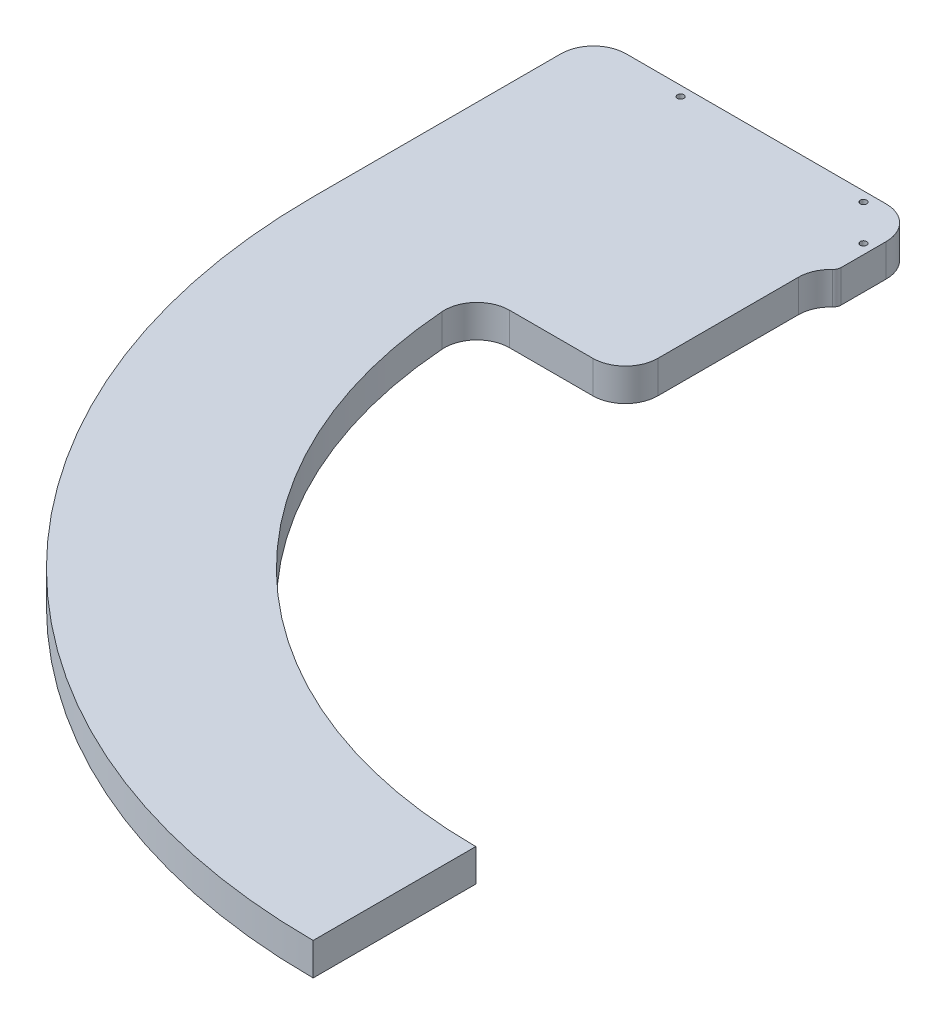
ISO-10303-21;
HEADER;
FILE_DESCRIPTION(('STEP AP214'),'2;1');
FILE_NAME('part.step','',(''),(''),'','','');
FILE_SCHEMA(('AUTOMOTIVE_DESIGN { 1 0 10303 214 1 1 1 1 }'));
ENDSEC;
DATA;
#1=APPLICATION_CONTEXT('core data for automotive mechanical design processes');
#2=APPLICATION_PROTOCOL_DEFINITION('international standard','automotive_design',2000,#1);
#3=PRODUCT_CONTEXT('',#1,'mechanical');
#4=PRODUCT('Part','Part','',(#3));
#5=PRODUCT_RELATED_PRODUCT_CATEGORY('part','',(#4));
#6=PRODUCT_DEFINITION_FORMATION('','',#4);
#7=PRODUCT_DEFINITION_CONTEXT('part definition',#1,'design');
#8=PRODUCT_DEFINITION('design','',#6,#7);
#9=PRODUCT_DEFINITION_SHAPE('','',#8);
#10=(LENGTH_UNIT() NAMED_UNIT(*) SI_UNIT(.MILLI.,.METRE.));
#11=(NAMED_UNIT(*) PLANE_ANGLE_UNIT() SI_UNIT($,.RADIAN.));
#12=(NAMED_UNIT(*) SI_UNIT($,.STERADIAN.) SOLID_ANGLE_UNIT());
#13=UNCERTAINTY_MEASURE_WITH_UNIT(LENGTH_MEASURE(1.E-05),#10,'distance_accuracy_value','');
#14=(GEOMETRIC_REPRESENTATION_CONTEXT(3) GLOBAL_UNCERTAINTY_ASSIGNED_CONTEXT((#13)) GLOBAL_UNIT_ASSIGNED_CONTEXT((#10,
#11,#12)) REPRESENTATION_CONTEXT('',''));
#15=CARTESIAN_POINT('',(0.,0.,0.));
#16=DIRECTION('',(0.,0.,1.));
#17=DIRECTION('',(1.,0.,0.));
#18=AXIS2_PLACEMENT_3D('',#15,#16,#17);
#19=CARTESIAN_POINT('',(246.106976730559,-10.,-1959.36496603701));
#20=DIRECTION('',(1.,0.,0.));
#21=DIRECTION('',(0.,0.,-1.));
#22=AXIS2_PLACEMENT_3D('',#19,#20,#21);
#23=PLANE('',#22);
#24=DIRECTION('',(0.,0.,-1.));
#25=VECTOR('',#24,1.);
#26=CARTESIAN_POINT('',(246.106976730559,0.,-1959.36496603701));
#27=LINE('',#26,#25);
#28=CARTESIAN_POINT('',(246.106976730559,0.,-1960.53011742692));
#29=VERTEX_POINT('',#28);
#30=CARTESIAN_POINT('',(246.106976730559,0.,-1974.36496603701));
#31=VERTEX_POINT('',#30);
#32=EDGE_CURVE('E177',#29,#31,#27,.T.);
#33=ORIENTED_EDGE('',*,*,#32,.F.);
#34=DIRECTION('',(0.,-1.,0.));
#35=VECTOR('',#34,1.);
#36=CARTESIAN_POINT('',(246.106976730559,-10.,-1960.53011742692));
#37=LINE('',#36,#35);
#38=CARTESIAN_POINT('',(246.106976730559,-10.,-1960.53011742692));
#39=VERTEX_POINT('',#38);
#40=EDGE_CURVE('E47',#29,#39,#37,.T.);
#41=ORIENTED_EDGE('',*,*,#40,.T.);
#42=DIRECTION('',(0.,0.,-1.));
#43=VECTOR('',#42,1.);
#44=CARTESIAN_POINT('',(246.106976730559,-10.,-1959.36496603701));
#45=LINE('',#44,#43);
#46=CARTESIAN_POINT('',(246.106976730559,-10.,-1974.36496603701));
#47=VERTEX_POINT('',#46);
#48=EDGE_CURVE('E198',#39,#47,#45,.T.);
#49=ORIENTED_EDGE('',*,*,#48,.T.);
#50=DIRECTION('',(0.,1.,0.));
#51=VECTOR('',#50,1.);
#52=CARTESIAN_POINT('',(246.106976730559,-10.,-1974.36496603701));
#53=LINE('',#52,#51);
#54=EDGE_CURVE('E221',#47,#31,#53,.T.);
#55=ORIENTED_EDGE('',*,*,#54,.T.);
#56=EDGE_LOOP('',(#33,#41,#49,#55));
#57=FACE_BOUND('',#56,.T.);
#58=ADVANCED_FACE('F39',(#57),#23,.T.);
#59=CARTESIAN_POINT('',(242.106976730559,-10.,-1898.16496623457));
#60=DIRECTION('',(1.,0.,0.));
#61=DIRECTION('',(0.,0.,-1.));
#62=AXIS2_PLACEMENT_3D('',#59,#60,#61);
#63=PLANE('',#62);
#64=DIRECTION('',(0.,0.,-1.));
#65=VECTOR('',#64,1.);
#66=CARTESIAN_POINT('',(242.106976730559,-10.,-1898.16496623457));
#67=LINE('',#66,#65);
#68=CARTESIAN_POINT('',(242.106976730559,-10.,-1908.16496623457));
#69=VERTEX_POINT('',#68);
#70=CARTESIAN_POINT('',(242.106976730559,-10.,-1951.36496603701));
#71=VERTEX_POINT('',#70);
#72=EDGE_CURVE('E158',#69,#71,#67,.T.);
#73=ORIENTED_EDGE('',*,*,#72,.T.);
#74=DIRECTION('',(0.,-1.,0.));
#75=VECTOR('',#74,1.);
#76=CARTESIAN_POINT('',(242.106976730559,0.,-1951.36496603701));
#77=LINE('',#76,#75);
#78=CARTESIAN_POINT('',(242.106976730559,0.,-1951.36496603701));
#79=VERTEX_POINT('',#78);
#80=EDGE_CURVE('E226',#71,#79,#77,.F.);
#81=ORIENTED_EDGE('',*,*,#80,.T.);
#82=DIRECTION('',(0.,0.,-1.));
#83=VECTOR('',#82,1.);
#84=CARTESIAN_POINT('',(242.106976730559,0.,-1898.16496623457));
#85=LINE('',#84,#83);
#86=CARTESIAN_POINT('',(242.106976730559,0.,-1908.16496623457));
#87=VERTEX_POINT('',#86);
#88=EDGE_CURVE('E195',#87,#79,#85,.T.);
#89=ORIENTED_EDGE('',*,*,#88,.F.);
#90=DIRECTION('',(0.,1.,0.));
#91=VECTOR('',#90,1.);
#92=CARTESIAN_POINT('',(242.106976730559,-10.,-1908.16496623457));
#93=LINE('',#92,#91);
#94=EDGE_CURVE('E224',#87,#69,#93,.F.);
#95=ORIENTED_EDGE('',*,*,#94,.T.);
#96=EDGE_LOOP('',(#73,#81,#89,#95));
#97=FACE_BOUND('',#96,.T.);
#98=ADVANCED_FACE('F259',(#97),#63,.T.);
#99=CARTESIAN_POINT('',(242.106976730559,-10.,-1898.16496623457));
#100=DIRECTION('',(0.,0.,1.));
#101=DIRECTION('',(1.,0.,0.));
#102=AXIS2_PLACEMENT_3D('',#99,#100,#101);
#103=PLANE('',#102);
#104=DIRECTION('',(1.,0.,0.));
#105=VECTOR('',#104,1.);
#106=CARTESIAN_POINT('',(242.106976730559,-10.,-1898.16496623457));
#107=LINE('',#106,#105);
#108=CARTESIAN_POINT('',(206.471339137691,-10.,-1898.16496623457));
#109=VERTEX_POINT('',#108);
#110=CARTESIAN_POINT('',(232.106976730559,-10.,-1898.16496623457));
#111=VERTEX_POINT('',#110);
#112=EDGE_CURVE('E172',#109,#111,#107,.T.);
#113=ORIENTED_EDGE('',*,*,#112,.T.);
#114=DIRECTION('',(0.,1.,0.));
#115=VECTOR('',#114,1.);
#116=CARTESIAN_POINT('',(232.106976730559,-10.,-1898.16496623457));
#117=LINE('',#116,#115);
#118=CARTESIAN_POINT('',(232.106976730559,0.,-1898.16496623457));
#119=VERTEX_POINT('',#118);
#120=EDGE_CURVE('E231',#111,#119,#117,.T.);
#121=ORIENTED_EDGE('',*,*,#120,.T.);
#122=DIRECTION('',(1.,0.,0.));
#123=VECTOR('',#122,1.);
#124=CARTESIAN_POINT('',(242.106976730559,0.,-1898.16496623457));
#125=LINE('',#124,#123);
#126=CARTESIAN_POINT('',(206.471339137691,0.,-1898.16496623457));
#127=VERTEX_POINT('',#126);
#128=EDGE_CURVE('E192',#127,#119,#125,.T.);
#129=ORIENTED_EDGE('',*,*,#128,.F.);
#130=DIRECTION('',(0.,-1.,0.));
#131=VECTOR('',#130,1.);
#132=CARTESIAN_POINT('',(206.471339137691,-10.,-1898.16496623457));
#133=LINE('',#132,#131);
#134=EDGE_CURVE('E229',#127,#109,#133,.T.);
#135=ORIENTED_EDGE('',*,*,#134,.T.);
#136=EDGE_LOOP('',(#113,#121,#129,#135));
#137=FACE_BOUND('',#136,.T.);
#138=ADVANCED_FACE('F268',(#137),#103,.T.);
#139=CARTESIAN_POINT('',(344.106976730557,-10.,-1898.16496623457));
#140=DIRECTION('',(0.,1.,0.));
#141=DIRECTION('',(0.,0.,1.));
#142=AXIS2_PLACEMENT_3D('',#139,#140,#141);
#143=CYLINDRICAL_SURFACE('',#142,147.998437438961);
#144=CARTESIAN_POINT('',(344.106976730557,-10.,-1898.16496623457));
#145=DIRECTION('',(0.,-1.,0.));
#146=DIRECTION('',(0.,0.,1.));
#147=AXIS2_PLACEMENT_3D('',#144,#145,#146);
#148=CIRCLE('',#147,147.998437438961);
#149=CARTESIAN_POINT('',(344.106976730557,-10.,-1750.16652879561));
#150=VERTEX_POINT('',#149);
#151=CARTESIAN_POINT('',(196.497629279292,-10.,-1887.44032034831));
#152=VERTEX_POINT('',#151);
#153=EDGE_CURVE('E166',#150,#152,#148,.T.);
#154=ORIENTED_EDGE('',*,*,#153,.T.);
#155=DIRECTION('',(0.,1.,0.));
#156=VECTOR('',#155,1.);
#157=CARTESIAN_POINT('',(196.497629279292,-10.,-1887.44032034831));
#158=LINE('',#157,#156);
#159=CARTESIAN_POINT('',(196.497629279292,0.,-1887.44032034831));
#160=VERTEX_POINT('',#159);
#161=EDGE_CURVE('E234',#152,#160,#158,.T.);
#162=ORIENTED_EDGE('',*,*,#161,.T.);
#163=CARTESIAN_POINT('',(344.106976730557,0.,-1898.16496623457));
#164=DIRECTION('',(0.,-1.,0.));
#165=DIRECTION('',(0.,0.,1.));
#166=AXIS2_PLACEMENT_3D('',#163,#164,#165);
#167=CIRCLE('',#166,147.998437438961);
#168=CARTESIAN_POINT('',(344.106976730557,0.,-1750.16652879561));
#169=VERTEX_POINT('',#168);
#170=EDGE_CURVE('E189',#169,#160,#167,.T.);
#171=ORIENTED_EDGE('',*,*,#170,.F.);
#172=DIRECTION('',(0.,1.,0.));
#173=VECTOR('',#172,1.);
#174=CARTESIAN_POINT('',(344.106976730557,-10.,-1750.16652879561));
#175=LINE('',#174,#173);
#176=EDGE_CURVE('E199',#150,#169,#175,.T.);
#177=ORIENTED_EDGE('',*,*,#176,.F.);
#178=EDGE_LOOP('',(#154,#162,#171,#177));
#179=FACE_BOUND('',#178,.T.);
#180=ADVANCED_FACE('F275',(#179),#143,.F.);
#181=CARTESIAN_POINT('',(344.106976730557,-10.,-1750.16652879561));
#182=DIRECTION('',(1.,0.,0.));
#183=DIRECTION('',(0.,0.,-1.));
#184=AXIS2_PLACEMENT_3D('',#181,#182,#183);
#185=PLANE('',#184);
#186=DIRECTION('',(0.,0.,-1.));
#187=VECTOR('',#186,1.);
#188=CARTESIAN_POINT('',(344.106976730557,0.,-1750.16652879561));
#189=LINE('',#188,#187);
#190=CARTESIAN_POINT('',(344.106976730557,0.,-1700.16652879561));
#191=VERTEX_POINT('',#190);
#192=EDGE_CURVE('E186',#191,#169,#189,.T.);
#193=ORIENTED_EDGE('',*,*,#192,.F.);
#194=DIRECTION('',(0.,1.,0.));
#195=VECTOR('',#194,1.);
#196=CARTESIAN_POINT('',(344.106976730557,-10.,-1700.16652879561));
#197=LINE('',#196,#195);
#198=CARTESIAN_POINT('',(344.106976730557,-10.,-1700.16652879561));
#199=VERTEX_POINT('',#198);
#200=EDGE_CURVE('E157',#199,#191,#197,.T.);
#201=ORIENTED_EDGE('',*,*,#200,.F.);
#202=DIRECTION('',(0.,0.,-1.));
#203=VECTOR('',#202,1.);
#204=CARTESIAN_POINT('',(344.106976730557,-10.,-1750.16652879561));
#205=LINE('',#204,#203);
#206=EDGE_CURVE('E164',#199,#150,#205,.T.);
#207=ORIENTED_EDGE('',*,*,#206,.T.);
#208=ORIENTED_EDGE('',*,*,#176,.T.);
#209=EDGE_LOOP('',(#193,#201,#207,#208));
#210=FACE_BOUND('',#209,.T.);
#211=ADVANCED_FACE('F279',(#210),#185,.T.);
#212=CARTESIAN_POINT('',(344.106976730557,-10.,-1898.16496623457));
#213=DIRECTION('',(0.,1.,0.));
#214=DIRECTION('',(0.,0.,1.));
#215=AXIS2_PLACEMENT_3D('',#212,#213,#214);
#216=CYLINDRICAL_SURFACE('',#215,197.998437438961);
#217=CARTESIAN_POINT('',(344.106976730557,0.,-1898.16496623457));
#218=DIRECTION('',(0.,1.,0.));
#219=DIRECTION('',(0.,0.,-1.));
#220=AXIS2_PLACEMENT_3D('',#217,#218,#219);
#221=CIRCLE('',#220,197.998437438961);
#222=CARTESIAN_POINT('',(146.108539291596,0.,-1898.16496623457));
#223=VERTEX_POINT('',#222);
#224=EDGE_CURVE('E156',#223,#191,#221,.T.);
#225=ORIENTED_EDGE('',*,*,#224,.F.);
#226=DIRECTION('',(0.,1.,0.));
#227=VECTOR('',#226,1.);
#228=CARTESIAN_POINT('',(146.108539291596,-10.,-1898.16496623457));
#229=LINE('',#228,#227);
#230=CARTESIAN_POINT('',(146.108539291596,-10.,-1898.16496623457));
#231=VERTEX_POINT('',#230);
#232=EDGE_CURVE('E142',#231,#223,#229,.T.);
#233=ORIENTED_EDGE('',*,*,#232,.F.);
#234=CARTESIAN_POINT('',(344.106976730557,-10.,-1898.16496623457));
#235=DIRECTION('',(0.,1.,0.));
#236=DIRECTION('',(0.,0.,-1.));
#237=AXIS2_PLACEMENT_3D('',#234,#235,#236);
#238=CIRCLE('',#237,197.998437438961);
#239=EDGE_CURVE('E149',#231,#199,#238,.T.);
#240=ORIENTED_EDGE('',*,*,#239,.T.);
#241=ORIENTED_EDGE('',*,*,#200,.T.);
#242=EDGE_LOOP('',(#225,#233,#240,#241));
#243=FACE_BOUND('',#242,.T.);
#244=ADVANCED_FACE('F154',(#243),#216,.T.);
#245=CARTESIAN_POINT('',(146.108539291596,-10.,-1980.36496603701));
#246=DIRECTION('',(-1.,0.,0.));
#247=DIRECTION('',(0.,0.,1.));
#248=AXIS2_PLACEMENT_3D('',#245,#246,#247);
#249=PLANE('',#248);
#250=DIRECTION('',(0.,0.,1.));
#251=VECTOR('',#250,1.);
#252=CARTESIAN_POINT('',(146.108539291596,0.,-1980.36496603701));
#253=LINE('',#252,#251);
#254=CARTESIAN_POINT('',(146.108539291596,0.,-1974.36496603701));
#255=VERTEX_POINT('',#254);
#256=EDGE_CURVE('E183',#255,#223,#253,.T.);
#257=ORIENTED_EDGE('',*,*,#256,.F.);
#258=DIRECTION('',(0.,1.,0.));
#259=VECTOR('',#258,1.);
#260=CARTESIAN_POINT('',(146.108539291596,-10.,-1974.36496603701));
#261=LINE('',#260,#259);
#262=CARTESIAN_POINT('',(146.108539291596,-10.,-1974.36496603701));
#263=VERTEX_POINT('',#262);
#264=EDGE_CURVE('E145',#255,#263,#261,.F.);
#265=ORIENTED_EDGE('',*,*,#264,.T.);
#266=DIRECTION('',(0.,0.,1.));
#267=VECTOR('',#266,1.);
#268=CARTESIAN_POINT('',(146.108539291596,-10.,-1984.36496603701));
#269=LINE('',#268,#267);
#270=EDGE_CURVE('E138',#263,#231,#269,.T.);
#271=ORIENTED_EDGE('',*,*,#270,.T.);
#272=ORIENTED_EDGE('',*,*,#232,.T.);
#273=EDGE_LOOP('',(#257,#265,#271,#272));
#274=FACE_BOUND('',#273,.T.);
#275=ADVANCED_FACE('F141',(#274),#249,.T.);
#276=CARTESIAN_POINT('',(246.106976730559,-10.,-1984.36496603701));
#277=DIRECTION('',(0.,0.,-1.));
#278=DIRECTION('',(-1.,0.,0.));
#279=AXIS2_PLACEMENT_3D('',#276,#277,#278);
#280=PLANE('',#279);
#281=DIRECTION('',(-1.,0.,0.));
#282=VECTOR('',#281,1.);
#283=CARTESIAN_POINT('',(246.106976730559,-10.,-1984.36496603701));
#284=LINE('',#283,#282);
#285=CARTESIAN_POINT('',(236.106976730559,-10.,-1984.36496603701));
#286=VERTEX_POINT('',#285);
#287=CARTESIAN_POINT('',(156.108539291596,-10.,-1984.36496603701));
#288=VERTEX_POINT('',#287);
#289=EDGE_CURVE('E150',#286,#288,#284,.T.);
#290=ORIENTED_EDGE('',*,*,#289,.T.);
#291=DIRECTION('',(0.,1.,0.));
#292=VECTOR('',#291,1.);
#293=CARTESIAN_POINT('',(156.108539291596,-10.,-1984.36496603701));
#294=LINE('',#293,#292);
#295=CARTESIAN_POINT('',(156.108539291596,0.,-1984.36496603701));
#296=VERTEX_POINT('',#295);
#297=EDGE_CURVE('E204',#288,#296,#294,.T.);
#298=ORIENTED_EDGE('',*,*,#297,.T.);
#299=DIRECTION('',(-1.,0.,0.));
#300=VECTOR('',#299,1.);
#301=CARTESIAN_POINT('',(246.106976730559,0.,-1984.36496603701));
#302=LINE('',#301,#300);
#303=CARTESIAN_POINT('',(236.106976730559,0.,-1984.36496603701));
#304=VERTEX_POINT('',#303);
#305=EDGE_CURVE('E179',#304,#296,#302,.T.);
#306=ORIENTED_EDGE('',*,*,#305,.F.);
#307=DIRECTION('',(0.,1.,0.));
#308=VECTOR('',#307,1.);
#309=CARTESIAN_POINT('',(236.106976730559,-10.,-1984.36496603701));
#310=LINE('',#309,#308);
#311=EDGE_CURVE('E201',#304,#286,#310,.F.);
#312=ORIENTED_EDGE('',*,*,#311,.T.);
#313=EDGE_LOOP('',(#290,#298,#306,#312));
#314=FACE_BOUND('',#313,.T.);
#315=ADVANCED_FACE('F287',(#314),#280,.T.);
#316=CARTESIAN_POINT('',(344.106976730557,-10.,-1898.16496623457));
#317=DIRECTION('',(0.,-1.,0.));
#318=DIRECTION('',(0.,0.,-1.));
#319=AXIS2_PLACEMENT_3D('',#316,#317,#318);
#320=PLANE('',#319);
#321=CARTESIAN_POINT('',(175.906976730563,-9.99999999999999,-1981.36496603701));
#322=DIRECTION('',(0.,1.,0.));
#323=DIRECTION('',(0.,0.,1.));
#324=AXIS2_PLACEMENT_3D('',#321,#322,#323);
#325=CIRCLE('',#324,1.);
#326=CARTESIAN_POINT('',(175.906976730563,-9.99999999999999,-1980.36496603701));
#327=VERTEX_POINT('',#326);
#328=EDGE_CURVE('E303',#327,#327,#325,.T.);
#329=ORIENTED_EDGE('',*,*,#328,.T.);
#330=EDGE_LOOP('',(#329));
#331=FACE_BOUND('',#330,.T.);
#332=CARTESIAN_POINT('',(232.106976730564,-9.99999999999999,-1981.36496603701));
#333=DIRECTION('',(0.,1.,0.));
#334=DIRECTION('',(0.,0.,1.));
#335=AXIS2_PLACEMENT_3D('',#332,#333,#334);
#336=CIRCLE('',#335,0.999999999999973);
#337=CARTESIAN_POINT('',(232.106976730564,-9.99999999999999,-1980.36496603701));
#338=VERTEX_POINT('',#337);
#339=EDGE_CURVE('E297',#338,#338,#336,.T.);
#340=ORIENTED_EDGE('',*,*,#339,.T.);
#341=EDGE_LOOP('',(#340));
#342=FACE_BOUND('',#341,.T.);
#343=CARTESIAN_POINT('',(243.106976730564,-9.99999999999999,-1970.36496603701));
#344=DIRECTION('',(0.,1.,0.));
#345=DIRECTION('',(0.,0.,1.));
#346=AXIS2_PLACEMENT_3D('',#343,#344,#345);
#347=CIRCLE('',#346,0.999999999999973);
#348=CARTESIAN_POINT('',(243.106976730564,-9.99999999999999,-1969.36496603701));
#349=VERTEX_POINT('',#348);
#350=EDGE_CURVE('E180',#349,#349,#347,.T.);
#351=ORIENTED_EDGE('',*,*,#350,.T.);
#352=EDGE_LOOP('',(#351));
#353=FACE_BOUND('',#352,.T.);
#354=ORIENTED_EDGE('',*,*,#48,.F.);
#355=CARTESIAN_POINT('',(243.606976730559,-10.,-1960.53011742692));
#356=DIRECTION('',(0.,-1.,0.));
#357=DIRECTION('',(0.,0.,-1.));
#358=AXIS2_PLACEMENT_3D('',#355,#356,#357);
#359=CIRCLE('',#358,2.5);
#360=CARTESIAN_POINT('',(245.306976730559,-10.,-1958.69708714894));
#361=VERTEX_POINT('',#360);
#362=EDGE_CURVE('E11',#39,#361,#359,.T.);
#363=ORIENTED_EDGE('',*,*,#362,.T.);
#364=CARTESIAN_POINT('',(252.106976730559,-10.,-1951.36496603701));
#365=DIRECTION('',(0.,-1.,0.));
#366=DIRECTION('',(0.,0.,-1.));
#367=AXIS2_PLACEMENT_3D('',#364,#365,#366);
#368=CIRCLE('',#367,10.);
#369=EDGE_CURVE('E239',#361,#71,#368,.F.);
#370=ORIENTED_EDGE('',*,*,#369,.T.);
#371=ORIENTED_EDGE('',*,*,#72,.F.);
#372=CARTESIAN_POINT('',(232.106976730559,-10.,-1908.16496623457));
#373=DIRECTION('',(0.,-1.,0.));
#374=DIRECTION('',(0.,0.,-1.));
#375=AXIS2_PLACEMENT_3D('',#372,#373,#374);
#376=CIRCLE('',#375,10.);
#377=EDGE_CURVE('E214',#69,#111,#376,.T.);
#378=ORIENTED_EDGE('',*,*,#377,.T.);
#379=ORIENTED_EDGE('',*,*,#112,.F.);
#380=CARTESIAN_POINT('',(206.471339137691,-10.,-1888.16496623457));
#381=DIRECTION('',(0.,-1.,0.));
#382=DIRECTION('',(0.,0.,-1.));
#383=AXIS2_PLACEMENT_3D('',#380,#381,#382);
#384=CIRCLE('',#383,10.);
#385=EDGE_CURVE('E243',#109,#152,#384,.F.);
#386=ORIENTED_EDGE('',*,*,#385,.T.);
#387=ORIENTED_EDGE('',*,*,#153,.F.);
#388=ORIENTED_EDGE('',*,*,#206,.F.);
#389=ORIENTED_EDGE('',*,*,#239,.F.);
#390=ORIENTED_EDGE('',*,*,#270,.F.);
#391=CARTESIAN_POINT('',(156.108539291596,-10.,-1974.36496603701));
#392=DIRECTION('',(0.,-1.,0.));
#393=DIRECTION('',(0.,0.,-1.));
#394=AXIS2_PLACEMENT_3D('',#391,#392,#393);
#395=CIRCLE('',#394,10.);
#396=EDGE_CURVE('E219',#263,#288,#395,.T.);
#397=ORIENTED_EDGE('',*,*,#396,.T.);
#398=ORIENTED_EDGE('',*,*,#289,.F.);
#399=CARTESIAN_POINT('',(236.106976730559,-10.,-1974.36496603701));
#400=DIRECTION('',(0.,-1.,0.));
#401=DIRECTION('',(0.,0.,-1.));
#402=AXIS2_PLACEMENT_3D('',#399,#400,#401);
#403=CIRCLE('',#402,10.);
#404=EDGE_CURVE('E216',#286,#47,#403,.T.);
#405=ORIENTED_EDGE('',*,*,#404,.T.);
#406=EDGE_LOOP('',(#354,#363,#370,#371,#378,#379,#386,#387,#388,#389,#390,#397,#398,#405));
#407=FACE_BOUND('',#406,.T.);
#408=ADVANCED_FACE('F161',(#331,#342,#353,#407),#320,.T.);
#409=CARTESIAN_POINT('',(344.106976730557,0.,-1898.16496623457));
#410=DIRECTION('',(0.,-1.,0.));
#411=DIRECTION('',(0.,0.,-1.));
#412=AXIS2_PLACEMENT_3D('',#409,#410,#411);
#413=PLANE('',#412);
#414=CARTESIAN_POINT('',(175.906976730563,0.,-1981.36496603701));
#415=DIRECTION('',(0.,1.,0.));
#416=DIRECTION('',(0.,0.,1.));
#417=AXIS2_PLACEMENT_3D('',#414,#415,#416);
#418=CIRCLE('',#417,1.);
#419=CARTESIAN_POINT('',(175.906976730563,0.,-1980.36496603701));
#420=VERTEX_POINT('',#419);
#421=EDGE_CURVE('E306',#420,#420,#418,.T.);
#422=ORIENTED_EDGE('',*,*,#421,.F.);
#423=EDGE_LOOP('',(#422));
#424=FACE_BOUND('',#423,.T.);
#425=CARTESIAN_POINT('',(232.106976730564,0.,-1981.36496603701));
#426=DIRECTION('',(0.,1.,0.));
#427=DIRECTION('',(0.,0.,1.));
#428=AXIS2_PLACEMENT_3D('',#425,#426,#427);
#429=CIRCLE('',#428,0.999999999999973);
#430=CARTESIAN_POINT('',(232.106976730564,0.,-1980.36496603701));
#431=VERTEX_POINT('',#430);
#432=EDGE_CURVE('E300',#431,#431,#429,.T.);
#433=ORIENTED_EDGE('',*,*,#432,.F.);
#434=EDGE_LOOP('',(#433));
#435=FACE_BOUND('',#434,.T.);
#436=CARTESIAN_POINT('',(243.106976730564,0.,-1970.36496603701));
#437=DIRECTION('',(0.,1.,0.));
#438=DIRECTION('',(0.,0.,1.));
#439=AXIS2_PLACEMENT_3D('',#436,#437,#438);
#440=CIRCLE('',#439,0.999999999999973);
#441=CARTESIAN_POINT('',(243.106976730564,0.,-1969.36496603701));
#442=VERTEX_POINT('',#441);
#443=EDGE_CURVE('E294',#442,#442,#440,.T.);
#444=ORIENTED_EDGE('',*,*,#443,.F.);
#445=EDGE_LOOP('',(#444));
#446=FACE_BOUND('',#445,.T.);
#447=CARTESIAN_POINT('',(252.106976730559,0.,-1951.36496603701));
#448=DIRECTION('',(0.,-1.,0.));
#449=DIRECTION('',(0.,0.,-1.));
#450=AXIS2_PLACEMENT_3D('',#447,#448,#449);
#451=CIRCLE('',#450,10.);
#452=CARTESIAN_POINT('',(245.306976730559,0.,-1958.69708714894));
#453=VERTEX_POINT('',#452);
#454=EDGE_CURVE('E237',#79,#453,#451,.T.);
#455=ORIENTED_EDGE('',*,*,#454,.T.);
#456=CARTESIAN_POINT('',(243.606976730559,0.,-1960.53011742692));
#457=DIRECTION('',(0.,-1.,0.));
#458=DIRECTION('',(0.,0.,-1.));
#459=AXIS2_PLACEMENT_3D('',#456,#457,#458);
#460=CIRCLE('',#459,2.5);
#461=EDGE_CURVE('E61',#453,#29,#460,.F.);
#462=ORIENTED_EDGE('',*,*,#461,.T.);
#463=ORIENTED_EDGE('',*,*,#32,.T.);
#464=CARTESIAN_POINT('',(236.106976730559,0.,-1974.36496603701));
#465=DIRECTION('',(0.,-1.,0.));
#466=DIRECTION('',(0.,0.,-1.));
#467=AXIS2_PLACEMENT_3D('',#464,#465,#466);
#468=CIRCLE('',#467,10.);
#469=EDGE_CURVE('E209',#31,#304,#468,.F.);
#470=ORIENTED_EDGE('',*,*,#469,.T.);
#471=ORIENTED_EDGE('',*,*,#305,.T.);
#472=CARTESIAN_POINT('',(156.108539291596,0.,-1974.36496603701));
#473=DIRECTION('',(0.,-1.,0.));
#474=DIRECTION('',(0.,0.,-1.));
#475=AXIS2_PLACEMENT_3D('',#472,#473,#474);
#476=CIRCLE('',#475,10.);
#477=EDGE_CURVE('E211',#296,#255,#476,.F.);
#478=ORIENTED_EDGE('',*,*,#477,.T.);
#479=ORIENTED_EDGE('',*,*,#256,.T.);
#480=ORIENTED_EDGE('',*,*,#224,.T.);
#481=ORIENTED_EDGE('',*,*,#192,.T.);
#482=ORIENTED_EDGE('',*,*,#170,.T.);
#483=CARTESIAN_POINT('',(206.471339137691,0.,-1888.16496623457));
#484=DIRECTION('',(0.,-1.,0.));
#485=DIRECTION('',(0.,0.,-1.));
#486=AXIS2_PLACEMENT_3D('',#483,#484,#485);
#487=CIRCLE('',#486,10.);
#488=EDGE_CURVE('E241',#160,#127,#487,.T.);
#489=ORIENTED_EDGE('',*,*,#488,.T.);
#490=ORIENTED_EDGE('',*,*,#128,.T.);
#491=CARTESIAN_POINT('',(232.106976730559,0.,-1908.16496623457));
#492=DIRECTION('',(0.,-1.,0.));
#493=DIRECTION('',(0.,0.,-1.));
#494=AXIS2_PLACEMENT_3D('',#491,#492,#493);
#495=CIRCLE('',#494,10.);
#496=EDGE_CURVE('E207',#119,#87,#495,.F.);
#497=ORIENTED_EDGE('',*,*,#496,.T.);
#498=ORIENTED_EDGE('',*,*,#88,.T.);
#499=EDGE_LOOP('',(#455,#462,#463,#470,#471,#478,#479,#480,#481,#482,#489,#490,#497,#498));
#500=FACE_BOUND('',#499,.T.);
#501=ADVANCED_FACE('F255',(#424,#435,#446,#500),#413,.F.);
#502=CARTESIAN_POINT('',(243.106976730564,0.,-1970.36496603701));
#503=DIRECTION('',(0.,1.,0.));
#504=DIRECTION('',(0.,0.,1.));
#505=AXIS2_PLACEMENT_3D('',#502,#503,#504);
#506=CYLINDRICAL_SURFACE('',#505,0.999999999999973);
#507=ORIENTED_EDGE('',*,*,#350,.F.);
#508=EDGE_LOOP('',(#507));
#509=FACE_BOUND('',#508,.T.);
#510=ORIENTED_EDGE('',*,*,#443,.T.);
#511=EDGE_LOOP('',(#510));
#512=FACE_BOUND('',#511,.T.);
#513=ADVANCED_FACE('F314',(#509,#512),#506,.F.);
#514=CARTESIAN_POINT('',(232.106976730564,0.,-1981.36496603701));
#515=DIRECTION('',(0.,1.,0.));
#516=DIRECTION('',(0.,0.,1.));
#517=AXIS2_PLACEMENT_3D('',#514,#515,#516);
#518=CYLINDRICAL_SURFACE('',#517,0.999999999999973);
#519=ORIENTED_EDGE('',*,*,#339,.F.);
#520=EDGE_LOOP('',(#519));
#521=FACE_BOUND('',#520,.T.);
#522=ORIENTED_EDGE('',*,*,#432,.T.);
#523=EDGE_LOOP('',(#522));
#524=FACE_BOUND('',#523,.T.);
#525=ADVANCED_FACE('F321',(#521,#524),#518,.F.);
#526=CARTESIAN_POINT('',(175.906976730563,0.,-1981.36496603701));
#527=DIRECTION('',(0.,1.,0.));
#528=DIRECTION('',(0.,0.,1.));
#529=AXIS2_PLACEMENT_3D('',#526,#527,#528);
#530=CYLINDRICAL_SURFACE('',#529,1.);
#531=ORIENTED_EDGE('',*,*,#328,.F.);
#532=EDGE_LOOP('',(#531));
#533=FACE_BOUND('',#532,.T.);
#534=ORIENTED_EDGE('',*,*,#421,.T.);
#535=EDGE_LOOP('',(#534));
#536=FACE_BOUND('',#535,.T.);
#537=ADVANCED_FACE('F310',(#533,#536),#530,.F.);
#538=CARTESIAN_POINT('',(156.108539291596,-10.,-1974.36496603701));
#539=DIRECTION('',(0.,1.,0.));
#540=DIRECTION('',(0.,0.,1.));
#541=AXIS2_PLACEMENT_3D('',#538,#539,#540);
#542=CYLINDRICAL_SURFACE('',#541,10.);
#543=ORIENTED_EDGE('',*,*,#396,.F.);
#544=ORIENTED_EDGE('',*,*,#264,.F.);
#545=ORIENTED_EDGE('',*,*,#477,.F.);
#546=ORIENTED_EDGE('',*,*,#297,.F.);
#547=EDGE_LOOP('',(#543,#544,#545,#546));
#548=FACE_BOUND('',#547,.T.);
#549=ADVANCED_FACE('F281',(#548),#542,.T.);
#550=CARTESIAN_POINT('',(236.106976730559,-10.,-1974.36496603701));
#551=DIRECTION('',(0.,1.,0.));
#552=DIRECTION('',(0.,0.,1.));
#553=AXIS2_PLACEMENT_3D('',#550,#551,#552);
#554=CYLINDRICAL_SURFACE('',#553,10.);
#555=ORIENTED_EDGE('',*,*,#404,.F.);
#556=ORIENTED_EDGE('',*,*,#311,.F.);
#557=ORIENTED_EDGE('',*,*,#469,.F.);
#558=ORIENTED_EDGE('',*,*,#54,.F.);
#559=EDGE_LOOP('',(#555,#556,#557,#558));
#560=FACE_BOUND('',#559,.T.);
#561=ADVANCED_FACE('F345',(#560),#554,.T.);
#562=CARTESIAN_POINT('',(252.106976730559,-10.,-1951.36496603701));
#563=DIRECTION('',(0.,1.,0.));
#564=DIRECTION('',(0.,0.,1.));
#565=AXIS2_PLACEMENT_3D('',#562,#563,#564);
#566=CYLINDRICAL_SURFACE('',#565,10.);
#567=ORIENTED_EDGE('',*,*,#369,.F.);
#568=DIRECTION('',(0.,1.,0.));
#569=VECTOR('',#568,1.);
#570=CARTESIAN_POINT('',(245.306976730559,-10.,-1958.69708714894));
#571=LINE('',#570,#569);
#572=EDGE_CURVE('E245',#361,#453,#571,.T.);
#573=ORIENTED_EDGE('',*,*,#572,.T.);
#574=ORIENTED_EDGE('',*,*,#454,.F.);
#575=ORIENTED_EDGE('',*,*,#80,.F.);
#576=EDGE_LOOP('',(#567,#573,#574,#575));
#577=FACE_BOUND('',#576,.T.);
#578=ADVANCED_FACE('F251',(#577),#566,.F.);
#579=CARTESIAN_POINT('',(232.106976730559,-10.,-1908.16496623457));
#580=DIRECTION('',(0.,1.,0.));
#581=DIRECTION('',(0.,0.,1.));
#582=AXIS2_PLACEMENT_3D('',#579,#580,#581);
#583=CYLINDRICAL_SURFACE('',#582,10.);
#584=ORIENTED_EDGE('',*,*,#377,.F.);
#585=ORIENTED_EDGE('',*,*,#94,.F.);
#586=ORIENTED_EDGE('',*,*,#496,.F.);
#587=ORIENTED_EDGE('',*,*,#120,.F.);
#588=EDGE_LOOP('',(#584,#585,#586,#587));
#589=FACE_BOUND('',#588,.T.);
#590=ADVANCED_FACE('F263',(#589),#583,.T.);
#591=CARTESIAN_POINT('',(206.471339137691,-10.,-1888.16496623457));
#592=DIRECTION('',(0.,1.,0.));
#593=DIRECTION('',(0.,0.,1.));
#594=AXIS2_PLACEMENT_3D('',#591,#592,#593);
#595=CYLINDRICAL_SURFACE('',#594,10.);
#596=ORIENTED_EDGE('',*,*,#385,.F.);
#597=ORIENTED_EDGE('',*,*,#134,.F.);
#598=ORIENTED_EDGE('',*,*,#488,.F.);
#599=ORIENTED_EDGE('',*,*,#161,.F.);
#600=EDGE_LOOP('',(#596,#597,#598,#599));
#601=FACE_BOUND('',#600,.T.);
#602=ADVANCED_FACE('F272',(#601),#595,.F.);
#603=CARTESIAN_POINT('',(243.606976730559,-10.,-1960.53011742692));
#604=DIRECTION('',(0.,1.,0.));
#605=DIRECTION('',(0.,0.,1.));
#606=AXIS2_PLACEMENT_3D('',#603,#604,#605);
#607=CYLINDRICAL_SURFACE('',#606,2.5);
#608=ORIENTED_EDGE('',*,*,#362,.F.);
#609=ORIENTED_EDGE('',*,*,#40,.F.);
#610=ORIENTED_EDGE('',*,*,#461,.F.);
#611=ORIENTED_EDGE('',*,*,#572,.F.);
#612=EDGE_LOOP('',(#608,#609,#610,#611));
#613=FACE_BOUND('',#612,.T.);
#614=ADVANCED_FACE('F41',(#613),#607,.T.);
#615=CLOSED_SHELL('',(#58,#98,#138,#180,#211,#244,#275,#315,#408,#501,#513,#525,#537,#549,#561,
#578,#590,#602,#614));
#616=MANIFOLD_SOLID_BREP('B2',#615);
#617=ADVANCED_BREP_SHAPE_REPRESENTATION('',(#18,#616),#14);
#618=SHAPE_DEFINITION_REPRESENTATION(#9,#617);
ENDSEC;
END-ISO-10303-21;
